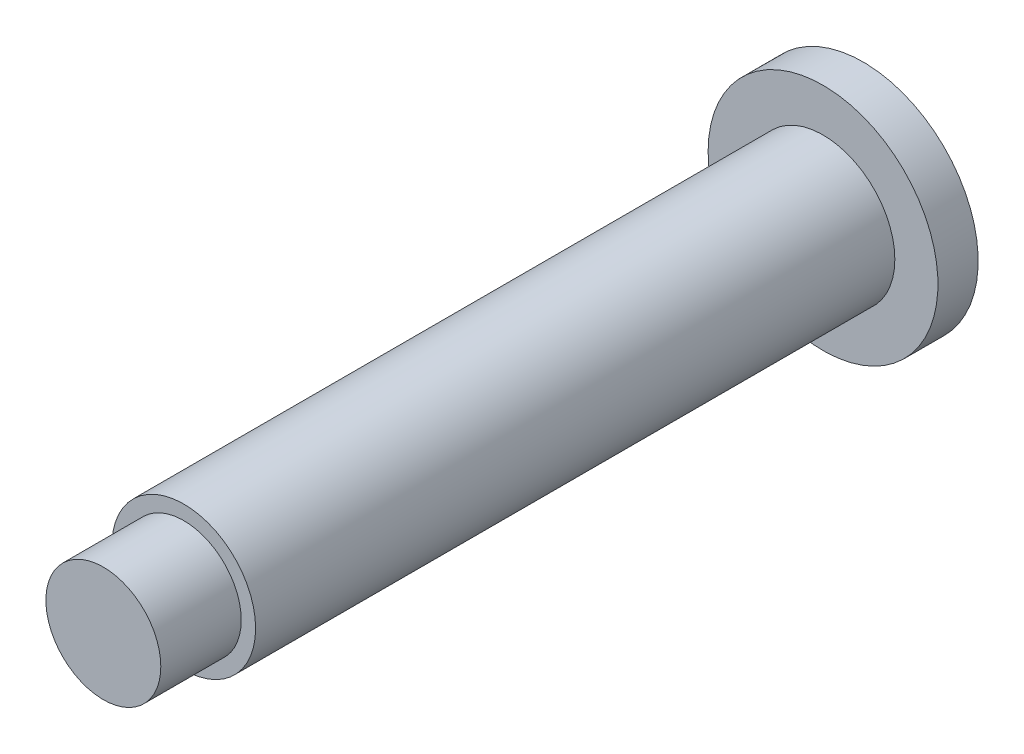
ISO-10303-21;
HEADER;
FILE_DESCRIPTION(('STEP AP214'),'2;1');
FILE_NAME('part.step','',(''),(''),'','','');
FILE_SCHEMA(('AUTOMOTIVE_DESIGN { 1 0 10303 214 1 1 1 1 }'));
ENDSEC;
DATA;
#1=APPLICATION_CONTEXT('core data for automotive mechanical design processes');
#2=APPLICATION_PROTOCOL_DEFINITION('international standard','automotive_design',2000,#1);
#3=PRODUCT_CONTEXT('',#1,'mechanical');
#4=PRODUCT('Part','Part','',(#3));
#5=PRODUCT_RELATED_PRODUCT_CATEGORY('part','',(#4));
#6=PRODUCT_DEFINITION_FORMATION('','',#4);
#7=PRODUCT_DEFINITION_CONTEXT('part definition',#1,'design');
#8=PRODUCT_DEFINITION('design','',#6,#7);
#9=PRODUCT_DEFINITION_SHAPE('','',#8);
#10=(LENGTH_UNIT() NAMED_UNIT(*) SI_UNIT(.MILLI.,.METRE.));
#11=(NAMED_UNIT(*) PLANE_ANGLE_UNIT() SI_UNIT($,.RADIAN.));
#12=(NAMED_UNIT(*) SI_UNIT($,.STERADIAN.) SOLID_ANGLE_UNIT());
#13=UNCERTAINTY_MEASURE_WITH_UNIT(LENGTH_MEASURE(1.E-05),#10,'distance_accuracy_value','');
#14=(GEOMETRIC_REPRESENTATION_CONTEXT(3) GLOBAL_UNCERTAINTY_ASSIGNED_CONTEXT((#13)) GLOBAL_UNIT_ASSIGNED_CONTEXT((#10,
#11,#12)) REPRESENTATION_CONTEXT('',''));
#15=CARTESIAN_POINT('',(0.,0.,0.));
#16=DIRECTION('',(0.,0.,1.));
#17=DIRECTION('',(1.,0.,0.));
#18=AXIS2_PLACEMENT_3D('',#15,#16,#17);
#19=CARTESIAN_POINT('',(0.,0.,22.25));
#20=DIRECTION('',(0.,0.,-1.));
#21=DIRECTION('',(-1.,0.,0.));
#22=AXIS2_PLACEMENT_3D('',#19,#20,#21);
#23=CYLINDRICAL_SURFACE('',#22,2.5);
#24=CARTESIAN_POINT('',(0.,0.,22.25));
#25=DIRECTION('',(0.,0.,1.));
#26=DIRECTION('',(1.,0.,0.));
#27=AXIS2_PLACEMENT_3D('',#24,#25,#26);
#28=CIRCLE('',#27,2.5);
#29=CARTESIAN_POINT('',(2.5,0.,22.25));
#30=VERTEX_POINT('',#29);
#31=EDGE_CURVE('E46',#30,#30,#28,.T.);
#32=ORIENTED_EDGE('',*,*,#31,.F.);
#33=EDGE_LOOP('',(#32));
#34=FACE_BOUND('',#33,.T.);
#35=CARTESIAN_POINT('',(0.,0.,0.));
#36=DIRECTION('',(0.,0.,1.));
#37=DIRECTION('',(1.,0.,0.));
#38=AXIS2_PLACEMENT_3D('',#35,#36,#37);
#39=CIRCLE('',#38,2.5);
#40=CARTESIAN_POINT('',(2.5,0.,0.));
#41=VERTEX_POINT('',#40);
#42=EDGE_CURVE('E42',#41,#41,#39,.T.);
#43=ORIENTED_EDGE('',*,*,#42,.T.);
#44=EDGE_LOOP('',(#43));
#45=FACE_BOUND('',#44,.T.);
#46=ADVANCED_FACE('F39',(#34,#45),#23,.T.);
#47=CARTESIAN_POINT('',(0.,0.,22.25));
#48=DIRECTION('',(0.,0.,1.));
#49=DIRECTION('',(1.,0.,0.));
#50=AXIS2_PLACEMENT_3D('',#47,#48,#49);
#51=PLANE('',#50);
#52=CARTESIAN_POINT('',(0.,0.,22.25));
#53=DIRECTION('',(0.,0.,1.));
#54=DIRECTION('',(1.,0.,0.));
#55=AXIS2_PLACEMENT_3D('',#52,#53,#54);
#56=CIRCLE('',#55,2.);
#57=CARTESIAN_POINT('',(2.,0.,22.25));
#58=VERTEX_POINT('',#57);
#59=EDGE_CURVE('E10',#58,#58,#56,.T.);
#60=ORIENTED_EDGE('',*,*,#59,.F.);
#61=EDGE_LOOP('',(#60));
#62=FACE_BOUND('',#61,.T.);
#63=ORIENTED_EDGE('',*,*,#31,.T.);
#64=EDGE_LOOP('',(#63));
#65=FACE_BOUND('',#64,.T.);
#66=ADVANCED_FACE('F88',(#62,#65),#51,.T.);
#67=CARTESIAN_POINT('',(0.,0.,-1.4));
#68=DIRECTION('',(0.,0.,1.));
#69=DIRECTION('',(1.,0.,0.));
#70=AXIS2_PLACEMENT_3D('',#67,#68,#69);
#71=CYLINDRICAL_SURFACE('',#70,4.);
#72=CARTESIAN_POINT('',(0.,0.,-1.4));
#73=DIRECTION('',(0.,0.,-1.));
#74=DIRECTION('',(-1.,0.,0.));
#75=AXIS2_PLACEMENT_3D('',#72,#73,#74);
#76=CIRCLE('',#75,4.);
#77=CARTESIAN_POINT('',(-4.,0.,-1.4));
#78=VERTEX_POINT('',#77);
#79=EDGE_CURVE('E61',#78,#78,#76,.T.);
#80=ORIENTED_EDGE('',*,*,#79,.F.);
#81=EDGE_LOOP('',(#80));
#82=FACE_BOUND('',#81,.T.);
#83=CARTESIAN_POINT('',(0.,0.,0.));
#84=DIRECTION('',(0.,0.,-1.));
#85=DIRECTION('',(-1.,0.,0.));
#86=AXIS2_PLACEMENT_3D('',#83,#84,#85);
#87=CIRCLE('',#86,4.);
#88=CARTESIAN_POINT('',(-4.,0.,0.));
#89=VERTEX_POINT('',#88);
#90=EDGE_CURVE('E57',#89,#89,#87,.T.);
#91=ORIENTED_EDGE('',*,*,#90,.T.);
#92=EDGE_LOOP('',(#91));
#93=FACE_BOUND('',#92,.T.);
#94=ADVANCED_FACE('F67',(#82,#93),#71,.T.);
#95=CARTESIAN_POINT('',(0.,0.,-1.4));
#96=DIRECTION('',(0.,0.,-1.));
#97=DIRECTION('',(-1.,0.,0.));
#98=AXIS2_PLACEMENT_3D('',#95,#96,#97);
#99=PLANE('',#98);
#100=CARTESIAN_POINT('',(0.,0.,-1.4));
#101=DIRECTION('',(0.,0.,-1.));
#102=DIRECTION('',(-1.,0.,0.));
#103=AXIS2_PLACEMENT_3D('',#100,#101,#102);
#104=CIRCLE('',#103,2.05);
#105=CARTESIAN_POINT('',(-2.05,0.,-1.4));
#106=VERTEX_POINT('',#105);
#107=EDGE_CURVE('E58',#106,#106,#104,.T.);
#108=ORIENTED_EDGE('',*,*,#107,.F.);
#109=EDGE_LOOP('',(#108));
#110=FACE_BOUND('',#109,.T.);
#111=ORIENTED_EDGE('',*,*,#79,.T.);
#112=EDGE_LOOP('',(#111));
#113=FACE_BOUND('',#112,.T.);
#114=ADVANCED_FACE('F72',(#110,#113),#99,.T.);
#115=CARTESIAN_POINT('',(0.,0.,0.));
#116=DIRECTION('',(0.,0.,-1.));
#117=DIRECTION('',(-1.,0.,0.));
#118=AXIS2_PLACEMENT_3D('',#115,#116,#117);
#119=PLANE('',#118);
#120=ORIENTED_EDGE('',*,*,#42,.F.);
#121=EDGE_LOOP('',(#120));
#122=FACE_BOUND('',#121,.T.);
#123=ORIENTED_EDGE('',*,*,#90,.F.);
#124=EDGE_LOOP('',(#123));
#125=FACE_BOUND('',#124,.T.);
#126=ADVANCED_FACE('F69',(#122,#125),#119,.F.);
#127=CARTESIAN_POINT('',(0.,0.,1.6));
#128=DIRECTION('',(0.,0.,-1.));
#129=DIRECTION('',(-1.,0.,0.));
#130=AXIS2_PLACEMENT_3D('',#127,#128,#129);
#131=CYLINDRICAL_SURFACE('',#130,2.05);
#132=CARTESIAN_POINT('',(0.,0.,1.6));
#133=DIRECTION('',(0.,0.,-1.));
#134=DIRECTION('',(-1.,0.,0.));
#135=AXIS2_PLACEMENT_3D('',#132,#133,#134);
#136=CIRCLE('',#135,2.05);
#137=CARTESIAN_POINT('',(-2.05,0.,1.6));
#138=VERTEX_POINT('',#137);
#139=EDGE_CURVE('E54',#138,#138,#136,.T.);
#140=ORIENTED_EDGE('',*,*,#139,.F.);
#141=EDGE_LOOP('',(#140));
#142=FACE_BOUND('',#141,.T.);
#143=ORIENTED_EDGE('',*,*,#107,.T.);
#144=EDGE_LOOP('',(#143));
#145=FACE_BOUND('',#144,.T.);
#146=ADVANCED_FACE('F71',(#142,#145),#131,.F.);
#147=CARTESIAN_POINT('',(0.,0.,1.6));
#148=DIRECTION('',(0.,0.,-1.));
#149=DIRECTION('',(-1.,0.,0.));
#150=AXIS2_PLACEMENT_3D('',#147,#148,#149);
#151=PLANE('',#150);
#152=ORIENTED_EDGE('',*,*,#139,.T.);
#153=EDGE_LOOP('',(#152));
#154=FACE_BOUND('',#153,.T.);
#155=ADVANCED_FACE('F80',(#154),#151,.T.);
#156=CARTESIAN_POINT('',(0.,0.,25.05));
#157=DIRECTION('',(0.,0.,-1.));
#158=DIRECTION('',(-1.,0.,0.));
#159=AXIS2_PLACEMENT_3D('',#156,#157,#158);
#160=CYLINDRICAL_SURFACE('',#159,2.);
#161=CARTESIAN_POINT('',(0.,0.,25.05));
#162=DIRECTION('',(0.,0.,1.));
#163=DIRECTION('',(1.,0.,0.));
#164=AXIS2_PLACEMENT_3D('',#161,#162,#163);
#165=CIRCLE('',#164,2.);
#166=CARTESIAN_POINT('',(2.,0.,25.05));
#167=VERTEX_POINT('',#166);
#168=EDGE_CURVE('E53',#167,#167,#165,.T.);
#169=ORIENTED_EDGE('',*,*,#168,.F.);
#170=EDGE_LOOP('',(#169));
#171=FACE_BOUND('',#170,.T.);
#172=ORIENTED_EDGE('',*,*,#59,.T.);
#173=EDGE_LOOP('',(#172));
#174=FACE_BOUND('',#173,.T.);
#175=ADVANCED_FACE('F135',(#171,#174),#160,.T.);
#176=CARTESIAN_POINT('',(0.,0.,25.05));
#177=DIRECTION('',(0.,0.,1.));
#178=DIRECTION('',(1.,0.,0.));
#179=AXIS2_PLACEMENT_3D('',#176,#177,#178);
#180=PLANE('',#179);
#181=ORIENTED_EDGE('',*,*,#168,.T.);
#182=EDGE_LOOP('',(#181));
#183=FACE_BOUND('',#182,.T.);
#184=ADVANCED_FACE('F144',(#183),#180,.T.);
#185=CLOSED_SHELL('',(#46,#66,#94,#114,#126,#146,#155,#175,#184));
#186=MANIFOLD_SOLID_BREP('B2',#185);
#187=ADVANCED_BREP_SHAPE_REPRESENTATION('',(#18,#186),#14);
#188=SHAPE_DEFINITION_REPRESENTATION(#9,#187);
ENDSEC;
END-ISO-10303-21;
